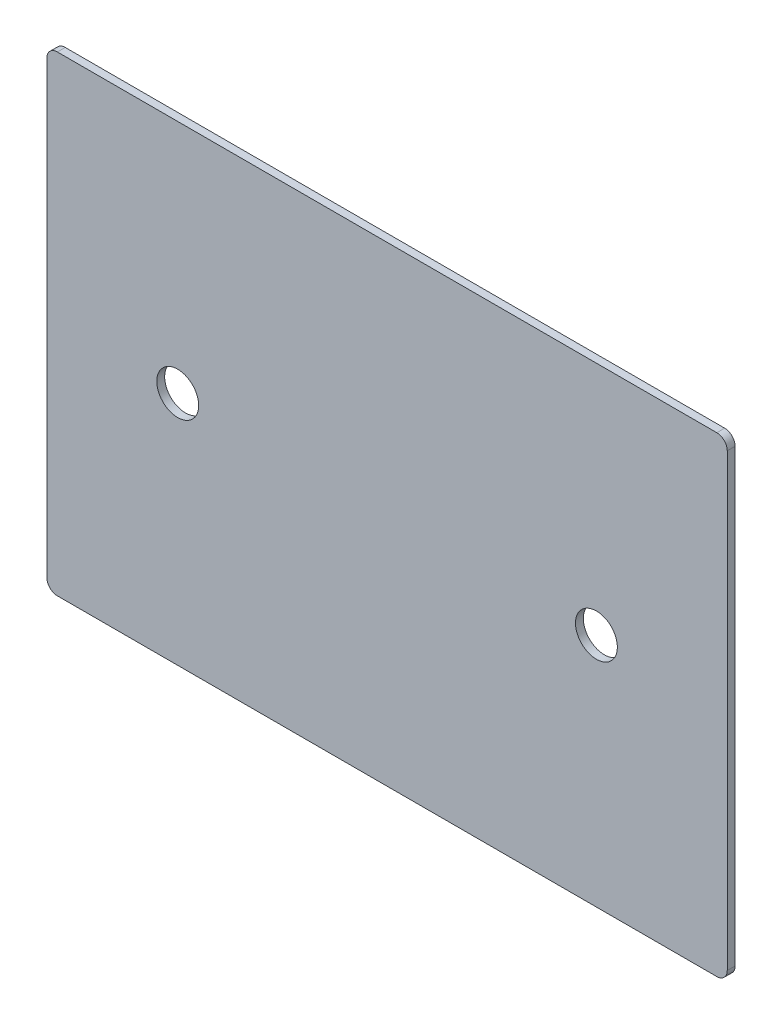
ISO-10303-21;
HEADER;
FILE_DESCRIPTION(('STEP AP214'),'2;1');
FILE_NAME('part.step','',(''),(''),'','','');
FILE_SCHEMA(('AUTOMOTIVE_DESIGN { 1 0 10303 214 1 1 1 1 }'));
ENDSEC;
DATA;
#1=APPLICATION_CONTEXT('core data for automotive mechanical design processes');
#2=APPLICATION_PROTOCOL_DEFINITION('international standard','automotive_design',2000,#1);
#3=PRODUCT_CONTEXT('',#1,'mechanical');
#4=PRODUCT('Part','Part','',(#3));
#5=PRODUCT_RELATED_PRODUCT_CATEGORY('part','',(#4));
#6=PRODUCT_DEFINITION_FORMATION('','',#4);
#7=PRODUCT_DEFINITION_CONTEXT('part definition',#1,'design');
#8=PRODUCT_DEFINITION('design','',#6,#7);
#9=PRODUCT_DEFINITION_SHAPE('','',#8);
#10=(LENGTH_UNIT() NAMED_UNIT(*) SI_UNIT(.MILLI.,.METRE.));
#11=(NAMED_UNIT(*) PLANE_ANGLE_UNIT() SI_UNIT($,.RADIAN.));
#12=(NAMED_UNIT(*) SI_UNIT($,.STERADIAN.) SOLID_ANGLE_UNIT());
#13=UNCERTAINTY_MEASURE_WITH_UNIT(LENGTH_MEASURE(1.E-05),#10,'distance_accuracy_value','');
#14=(GEOMETRIC_REPRESENTATION_CONTEXT(3) GLOBAL_UNCERTAINTY_ASSIGNED_CONTEXT((#13)) GLOBAL_UNIT_ASSIGNED_CONTEXT((#10,
#11,#12)) REPRESENTATION_CONTEXT('',''));
#15=CARTESIAN_POINT('',(0.,0.,0.));
#16=DIRECTION('',(0.,0.,1.));
#17=DIRECTION('',(1.,0.,0.));
#18=AXIS2_PLACEMENT_3D('',#15,#16,#17);
#19=CARTESIAN_POINT('',(65.,45.,1.5));
#20=DIRECTION('',(-1.,0.,0.));
#21=DIRECTION('',(0.,-1.,0.));
#22=AXIS2_PLACEMENT_3D('',#19,#20,#21);
#23=PLANE('',#22);
#24=DIRECTION('',(0.,1.,0.));
#25=VECTOR('',#24,1.);
#26=CARTESIAN_POINT('',(65.,45.,0.));
#27=LINE('',#26,#25);
#28=CARTESIAN_POINT('',(65.,-43.,0.));
#29=VERTEX_POINT('',#28);
#30=CARTESIAN_POINT('',(65.,43.,0.));
#31=VERTEX_POINT('',#30);
#32=EDGE_CURVE('E126',#29,#31,#27,.T.);
#33=ORIENTED_EDGE('',*,*,#32,.T.);
#34=DIRECTION('',(0.,0.,-1.));
#35=VECTOR('',#34,1.);
#36=CARTESIAN_POINT('',(65.,43.,1.5));
#37=LINE('',#36,#35);
#38=CARTESIAN_POINT('',(65.,43.,1.5));
#39=VERTEX_POINT('',#38);
#40=EDGE_CURVE('E104',#31,#39,#37,.F.);
#41=ORIENTED_EDGE('',*,*,#40,.T.);
#42=DIRECTION('',(0.,1.,0.));
#43=VECTOR('',#42,1.);
#44=CARTESIAN_POINT('',(65.,45.,1.5));
#45=LINE('',#44,#43);
#46=CARTESIAN_POINT('',(65.,-43.,1.5));
#47=VERTEX_POINT('',#46);
#48=EDGE_CURVE('E136',#47,#39,#45,.T.);
#49=ORIENTED_EDGE('',*,*,#48,.F.);
#50=DIRECTION('',(0.,0.,-1.));
#51=VECTOR('',#50,1.);
#52=CARTESIAN_POINT('',(65.,-43.,1.5));
#53=LINE('',#52,#51);
#54=EDGE_CURVE('E109',#47,#29,#53,.T.);
#55=ORIENTED_EDGE('',*,*,#54,.T.);
#56=EDGE_LOOP('',(#33,#41,#49,#55));
#57=FACE_BOUND('',#56,.T.);
#58=ADVANCED_FACE('F33',(#57),#23,.F.);
#59=CARTESIAN_POINT('',(-65.,45.,1.5));
#60=DIRECTION('',(0.,-1.,0.));
#61=DIRECTION('',(0.,0.,-1.));
#62=AXIS2_PLACEMENT_3D('',#59,#60,#61);
#63=PLANE('',#62);
#64=DIRECTION('',(-1.,0.,0.));
#65=VECTOR('',#64,1.);
#66=CARTESIAN_POINT('',(-65.,45.,1.5));
#67=LINE('',#66,#65);
#68=CARTESIAN_POINT('',(63.,45.,1.5));
#69=VERTEX_POINT('',#68);
#70=CARTESIAN_POINT('',(-63.,45.,1.5));
#71=VERTEX_POINT('',#70);
#72=EDGE_CURVE('E119',#69,#71,#67,.T.);
#73=ORIENTED_EDGE('',*,*,#72,.F.);
#74=DIRECTION('',(0.,0.,-1.));
#75=VECTOR('',#74,1.);
#76=CARTESIAN_POINT('',(63.,45.,1.5));
#77=LINE('',#76,#75);
#78=CARTESIAN_POINT('',(63.,45.,0.));
#79=VERTEX_POINT('',#78);
#80=EDGE_CURVE('E103',#69,#79,#77,.T.);
#81=ORIENTED_EDGE('',*,*,#80,.T.);
#82=DIRECTION('',(-1.,0.,0.));
#83=VECTOR('',#82,1.);
#84=CARTESIAN_POINT('',(-65.,45.,0.));
#85=LINE('',#84,#83);
#86=CARTESIAN_POINT('',(-63.,45.,0.));
#87=VERTEX_POINT('',#86);
#88=EDGE_CURVE('E116',#79,#87,#85,.T.);
#89=ORIENTED_EDGE('',*,*,#88,.T.);
#90=DIRECTION('',(0.,0.,-1.));
#91=VECTOR('',#90,1.);
#92=CARTESIAN_POINT('',(-63.,45.,1.5));
#93=LINE('',#92,#91);
#94=EDGE_CURVE('E121',#87,#71,#93,.F.);
#95=ORIENTED_EDGE('',*,*,#94,.T.);
#96=EDGE_LOOP('',(#73,#81,#89,#95));
#97=FACE_BOUND('',#96,.T.);
#98=ADVANCED_FACE('F115',(#97),#63,.F.);
#99=CARTESIAN_POINT('',(-65.,45.,1.5));
#100=DIRECTION('',(1.,0.,0.));
#101=DIRECTION('',(0.,1.,0.));
#102=AXIS2_PLACEMENT_3D('',#99,#100,#101);
#103=PLANE('',#102);
#104=DIRECTION('',(0.,-1.,0.));
#105=VECTOR('',#104,1.);
#106=CARTESIAN_POINT('',(-65.,45.,0.));
#107=LINE('',#106,#105);
#108=CARTESIAN_POINT('',(-65.,43.,0.));
#109=VERTEX_POINT('',#108);
#110=CARTESIAN_POINT('',(-65.,-43.,0.));
#111=VERTEX_POINT('',#110);
#112=EDGE_CURVE('E125',#109,#111,#107,.T.);
#113=ORIENTED_EDGE('',*,*,#112,.T.);
#114=DIRECTION('',(0.,0.,-1.));
#115=VECTOR('',#114,1.);
#116=CARTESIAN_POINT('',(-65.,-43.,1.5));
#117=LINE('',#116,#115);
#118=CARTESIAN_POINT('',(-65.,-43.,1.5));
#119=VERTEX_POINT('',#118);
#120=EDGE_CURVE('E11',#111,#119,#117,.F.);
#121=ORIENTED_EDGE('',*,*,#120,.T.);
#122=DIRECTION('',(0.,-1.,0.));
#123=VECTOR('',#122,1.);
#124=CARTESIAN_POINT('',(-65.,45.,1.5));
#125=LINE('',#124,#123);
#126=CARTESIAN_POINT('',(-65.,43.,1.5));
#127=VERTEX_POINT('',#126);
#128=EDGE_CURVE('E162',#127,#119,#125,.T.);
#129=ORIENTED_EDGE('',*,*,#128,.F.);
#130=DIRECTION('',(0.,0.,-1.));
#131=VECTOR('',#130,1.);
#132=CARTESIAN_POINT('',(-65.,43.,1.5));
#133=LINE('',#132,#131);
#134=EDGE_CURVE('E41',#127,#109,#133,.T.);
#135=ORIENTED_EDGE('',*,*,#134,.T.);
#136=EDGE_LOOP('',(#113,#121,#129,#135));
#137=FACE_BOUND('',#136,.T.);
#138=ADVANCED_FACE('F160',(#137),#103,.F.);
#139=CARTESIAN_POINT('',(-65.,-45.,1.5));
#140=DIRECTION('',(0.,1.,0.));
#141=DIRECTION('',(0.,0.,1.));
#142=AXIS2_PLACEMENT_3D('',#139,#140,#141);
#143=PLANE('',#142);
#144=DIRECTION('',(1.,0.,0.));
#145=VECTOR('',#144,1.);
#146=CARTESIAN_POINT('',(-65.,-45.,0.));
#147=LINE('',#146,#145);
#148=CARTESIAN_POINT('',(-63.,-45.,0.));
#149=VERTEX_POINT('',#148);
#150=CARTESIAN_POINT('',(63.,-45.,0.));
#151=VERTEX_POINT('',#150);
#152=EDGE_CURVE('E129',#149,#151,#147,.T.);
#153=ORIENTED_EDGE('',*,*,#152,.T.);
#154=DIRECTION('',(0.,0.,-1.));
#155=VECTOR('',#154,1.);
#156=CARTESIAN_POINT('',(63.,-45.,1.5));
#157=LINE('',#156,#155);
#158=CARTESIAN_POINT('',(63.,-45.,1.5));
#159=VERTEX_POINT('',#158);
#160=EDGE_CURVE('E48',#151,#159,#157,.F.);
#161=ORIENTED_EDGE('',*,*,#160,.T.);
#162=DIRECTION('',(1.,0.,0.));
#163=VECTOR('',#162,1.);
#164=CARTESIAN_POINT('',(-65.,-45.,1.5));
#165=LINE('',#164,#163);
#166=CARTESIAN_POINT('',(-63.,-45.,1.5));
#167=VERTEX_POINT('',#166);
#168=EDGE_CURVE('E137',#167,#159,#165,.T.);
#169=ORIENTED_EDGE('',*,*,#168,.F.);
#170=DIRECTION('',(0.,0.,-1.));
#171=VECTOR('',#170,1.);
#172=CARTESIAN_POINT('',(-63.,-45.,1.5));
#173=LINE('',#172,#171);
#174=EDGE_CURVE('E153',#167,#149,#173,.T.);
#175=ORIENTED_EDGE('',*,*,#174,.T.);
#176=EDGE_LOOP('',(#153,#161,#169,#175));
#177=FACE_BOUND('',#176,.T.);
#178=ADVANCED_FACE('F169',(#177),#143,.F.);
#179=CARTESIAN_POINT('',(0.,0.,1.5));
#180=DIRECTION('',(0.,0.,1.));
#181=DIRECTION('',(1.,0.,0.));
#182=AXIS2_PLACEMENT_3D('',#179,#180,#181);
#183=PLANE('',#182);
#184=CARTESIAN_POINT('',(-40.,0.,1.5));
#185=DIRECTION('',(0.,0.,1.));
#186=DIRECTION('',(1.,0.,0.));
#187=AXIS2_PLACEMENT_3D('',#184,#185,#186);
#188=CIRCLE('',#187,4.);
#189=CARTESIAN_POINT('',(-36.,0.,1.5));
#190=VERTEX_POINT('',#189);
#191=EDGE_CURVE('E182',#190,#190,#188,.T.);
#192=ORIENTED_EDGE('',*,*,#191,.F.);
#193=EDGE_LOOP('',(#192));
#194=FACE_BOUND('',#193,.T.);
#195=CARTESIAN_POINT('',(40.,0.,1.5));
#196=DIRECTION('',(0.,0.,1.));
#197=DIRECTION('',(-1.,0.,0.));
#198=AXIS2_PLACEMENT_3D('',#195,#196,#197);
#199=CIRCLE('',#198,4.);
#200=CARTESIAN_POINT('',(36.,0.,1.5));
#201=VERTEX_POINT('',#200);
#202=EDGE_CURVE('E176',#201,#201,#199,.T.);
#203=ORIENTED_EDGE('',*,*,#202,.F.);
#204=EDGE_LOOP('',(#203));
#205=FACE_BOUND('',#204,.T.);
#206=ORIENTED_EDGE('',*,*,#48,.T.);
#207=CARTESIAN_POINT('',(63.,43.,1.5));
#208=DIRECTION('',(0.,0.,1.));
#209=DIRECTION('',(1.,0.,0.));
#210=AXIS2_PLACEMENT_3D('',#207,#208,#209);
#211=CIRCLE('',#210,2.);
#212=EDGE_CURVE('E151',#39,#69,#211,.T.);
#213=ORIENTED_EDGE('',*,*,#212,.T.);
#214=ORIENTED_EDGE('',*,*,#72,.T.);
#215=CARTESIAN_POINT('',(-63.,43.,1.5));
#216=DIRECTION('',(0.,0.,1.));
#217=DIRECTION('',(1.,0.,0.));
#218=AXIS2_PLACEMENT_3D('',#215,#216,#217);
#219=CIRCLE('',#218,2.);
#220=EDGE_CURVE('E146',#71,#127,#219,.T.);
#221=ORIENTED_EDGE('',*,*,#220,.T.);
#222=ORIENTED_EDGE('',*,*,#128,.T.);
#223=CARTESIAN_POINT('',(-63.,-43.,1.5));
#224=DIRECTION('',(0.,0.,1.));
#225=DIRECTION('',(1.,0.,0.));
#226=AXIS2_PLACEMENT_3D('',#223,#224,#225);
#227=CIRCLE('',#226,2.);
#228=EDGE_CURVE('E55',#119,#167,#227,.T.);
#229=ORIENTED_EDGE('',*,*,#228,.T.);
#230=ORIENTED_EDGE('',*,*,#168,.T.);
#231=CARTESIAN_POINT('',(63.,-43.,1.5));
#232=DIRECTION('',(0.,0.,1.));
#233=DIRECTION('',(1.,0.,0.));
#234=AXIS2_PLACEMENT_3D('',#231,#232,#233);
#235=CIRCLE('',#234,2.);
#236=EDGE_CURVE('E149',#159,#47,#235,.T.);
#237=ORIENTED_EDGE('',*,*,#236,.T.);
#238=EDGE_LOOP('',(#206,#213,#214,#221,#222,#229,#230,#237));
#239=FACE_BOUND('',#238,.T.);
#240=ADVANCED_FACE('F197',(#194,#205,#239),#183,.T.);
#241=CARTESIAN_POINT('',(0.,0.,0.));
#242=DIRECTION('',(0.,0.,1.));
#243=DIRECTION('',(1.,0.,0.));
#244=AXIS2_PLACEMENT_3D('',#241,#242,#243);
#245=PLANE('',#244);
#246=CARTESIAN_POINT('',(-40.,0.,0.));
#247=DIRECTION('',(0.,0.,1.));
#248=DIRECTION('',(1.,0.,0.));
#249=AXIS2_PLACEMENT_3D('',#246,#247,#248);
#250=CIRCLE('',#249,4.);
#251=CARTESIAN_POINT('',(-36.,0.,0.));
#252=VERTEX_POINT('',#251);
#253=EDGE_CURVE('E131',#252,#252,#250,.T.);
#254=ORIENTED_EDGE('',*,*,#253,.T.);
#255=EDGE_LOOP('',(#254));
#256=FACE_BOUND('',#255,.T.);
#257=CARTESIAN_POINT('',(40.,0.,0.));
#258=DIRECTION('',(0.,0.,1.));
#259=DIRECTION('',(-1.,0.,0.));
#260=AXIS2_PLACEMENT_3D('',#257,#258,#259);
#261=CIRCLE('',#260,4.);
#262=CARTESIAN_POINT('',(36.,0.,0.));
#263=VERTEX_POINT('',#262);
#264=EDGE_CURVE('E179',#263,#263,#261,.T.);
#265=ORIENTED_EDGE('',*,*,#264,.T.);
#266=EDGE_LOOP('',(#265));
#267=FACE_BOUND('',#266,.T.);
#268=ORIENTED_EDGE('',*,*,#88,.F.);
#269=CARTESIAN_POINT('',(63.,43.,0.));
#270=DIRECTION('',(0.,0.,1.));
#271=DIRECTION('',(1.,0.,0.));
#272=AXIS2_PLACEMENT_3D('',#269,#270,#271);
#273=CIRCLE('',#272,2.);
#274=EDGE_CURVE('E99',#79,#31,#273,.F.);
#275=ORIENTED_EDGE('',*,*,#274,.T.);
#276=ORIENTED_EDGE('',*,*,#32,.F.);
#277=CARTESIAN_POINT('',(63.,-43.,0.));
#278=DIRECTION('',(0.,0.,1.));
#279=DIRECTION('',(1.,0.,0.));
#280=AXIS2_PLACEMENT_3D('',#277,#278,#279);
#281=CIRCLE('',#280,2.);
#282=EDGE_CURVE('E110',#29,#151,#281,.F.);
#283=ORIENTED_EDGE('',*,*,#282,.T.);
#284=ORIENTED_EDGE('',*,*,#152,.F.);
#285=CARTESIAN_POINT('',(-63.,-43.,0.));
#286=DIRECTION('',(0.,0.,1.));
#287=DIRECTION('',(1.,0.,0.));
#288=AXIS2_PLACEMENT_3D('',#285,#286,#287);
#289=CIRCLE('',#288,2.);
#290=EDGE_CURVE('E140',#149,#111,#289,.F.);
#291=ORIENTED_EDGE('',*,*,#290,.T.);
#292=ORIENTED_EDGE('',*,*,#112,.F.);
#293=CARTESIAN_POINT('',(-63.,43.,0.));
#294=DIRECTION('',(0.,0.,1.));
#295=DIRECTION('',(1.,0.,0.));
#296=AXIS2_PLACEMENT_3D('',#293,#294,#295);
#297=CIRCLE('',#296,2.);
#298=EDGE_CURVE('E120',#109,#87,#297,.F.);
#299=ORIENTED_EDGE('',*,*,#298,.T.);
#300=EDGE_LOOP('',(#268,#275,#276,#283,#284,#291,#292,#299));
#301=FACE_BOUND('',#300,.T.);
#302=ADVANCED_FACE('F123',(#256,#267,#301),#245,.F.);
#303=CARTESIAN_POINT('',(40.,0.,0.));
#304=DIRECTION('',(0.,0.,1.));
#305=DIRECTION('',(1.,0.,0.));
#306=AXIS2_PLACEMENT_3D('',#303,#304,#305);
#307=CYLINDRICAL_SURFACE('',#306,4.);
#308=ORIENTED_EDGE('',*,*,#264,.F.);
#309=EDGE_LOOP('',(#308));
#310=FACE_BOUND('',#309,.T.);
#311=ORIENTED_EDGE('',*,*,#202,.T.);
#312=EDGE_LOOP('',(#311));
#313=FACE_BOUND('',#312,.T.);
#314=ADVANCED_FACE('F193',(#310,#313),#307,.F.);
#315=CARTESIAN_POINT('',(-40.,0.,0.));
#316=DIRECTION('',(0.,0.,1.));
#317=DIRECTION('',(1.,0.,0.));
#318=AXIS2_PLACEMENT_3D('',#315,#316,#317);
#319=CYLINDRICAL_SURFACE('',#318,4.);
#320=ORIENTED_EDGE('',*,*,#253,.F.);
#321=EDGE_LOOP('',(#320));
#322=FACE_BOUND('',#321,.T.);
#323=ORIENTED_EDGE('',*,*,#191,.T.);
#324=EDGE_LOOP('',(#323));
#325=FACE_BOUND('',#324,.T.);
#326=ADVANCED_FACE('F190',(#322,#325),#319,.F.);
#327=CARTESIAN_POINT('',(63.,43.,1.5));
#328=DIRECTION('',(0.,0.,-1.));
#329=DIRECTION('',(-1.,0.,0.));
#330=AXIS2_PLACEMENT_3D('',#327,#328,#329);
#331=CYLINDRICAL_SURFACE('',#330,2.);
#332=ORIENTED_EDGE('',*,*,#212,.F.);
#333=ORIENTED_EDGE('',*,*,#40,.F.);
#334=ORIENTED_EDGE('',*,*,#274,.F.);
#335=ORIENTED_EDGE('',*,*,#80,.F.);
#336=EDGE_LOOP('',(#332,#333,#334,#335));
#337=FACE_BOUND('',#336,.T.);
#338=ADVANCED_FACE('F102',(#337),#331,.T.);
#339=CARTESIAN_POINT('',(63.,-43.,1.5));
#340=DIRECTION('',(0.,0.,-1.));
#341=DIRECTION('',(-1.,0.,0.));
#342=AXIS2_PLACEMENT_3D('',#339,#340,#341);
#343=CYLINDRICAL_SURFACE('',#342,2.);
#344=ORIENTED_EDGE('',*,*,#236,.F.);
#345=ORIENTED_EDGE('',*,*,#160,.F.);
#346=ORIENTED_EDGE('',*,*,#282,.F.);
#347=ORIENTED_EDGE('',*,*,#54,.F.);
#348=EDGE_LOOP('',(#344,#345,#346,#347));
#349=FACE_BOUND('',#348,.T.);
#350=ADVANCED_FACE('F206',(#349),#343,.T.);
#351=CARTESIAN_POINT('',(-63.,-43.,1.5));
#352=DIRECTION('',(0.,0.,-1.));
#353=DIRECTION('',(-1.,0.,0.));
#354=AXIS2_PLACEMENT_3D('',#351,#352,#353);
#355=CYLINDRICAL_SURFACE('',#354,2.);
#356=ORIENTED_EDGE('',*,*,#228,.F.);
#357=ORIENTED_EDGE('',*,*,#120,.F.);
#358=ORIENTED_EDGE('',*,*,#290,.F.);
#359=ORIENTED_EDGE('',*,*,#174,.F.);
#360=EDGE_LOOP('',(#356,#357,#358,#359));
#361=FACE_BOUND('',#360,.T.);
#362=ADVANCED_FACE('F168',(#361),#355,.T.);
#363=CARTESIAN_POINT('',(-63.,43.,1.5));
#364=DIRECTION('',(0.,0.,-1.));
#365=DIRECTION('',(-1.,0.,0.));
#366=AXIS2_PLACEMENT_3D('',#363,#364,#365);
#367=CYLINDRICAL_SURFACE('',#366,2.);
#368=ORIENTED_EDGE('',*,*,#220,.F.);
#369=ORIENTED_EDGE('',*,*,#94,.F.);
#370=ORIENTED_EDGE('',*,*,#298,.F.);
#371=ORIENTED_EDGE('',*,*,#134,.F.);
#372=EDGE_LOOP('',(#368,#369,#370,#371));
#373=FACE_BOUND('',#372,.T.);
#374=ADVANCED_FACE('F35',(#373),#367,.T.);
#375=CLOSED_SHELL('',(#58,#98,#138,#178,#240,#302,#314,#326,#338,#350,#362,#374));
#376=MANIFOLD_SOLID_BREP('B2',#375);
#377=ADVANCED_BREP_SHAPE_REPRESENTATION('',(#18,#376),#14);
#378=SHAPE_DEFINITION_REPRESENTATION(#9,#377);
ENDSEC;
END-ISO-10303-21;
